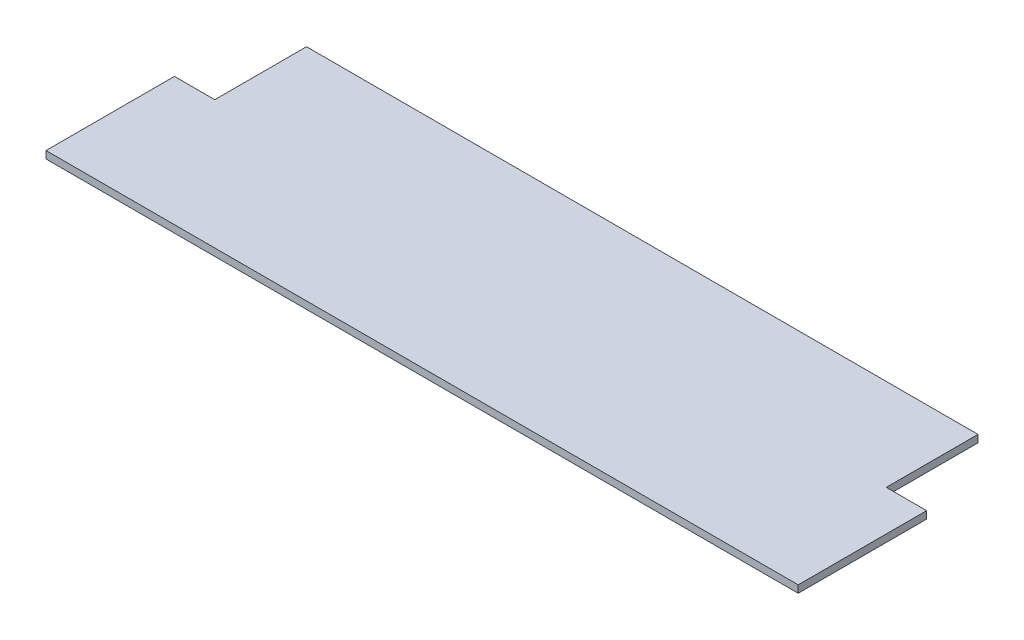
ISO-10303-21;
HEADER;
FILE_DESCRIPTION(('STEP AP214'),'2;1');
FILE_NAME('part.step','',(''),(''),'','','');
FILE_SCHEMA(('AUTOMOTIVE_DESIGN { 1 0 10303 214 1 1 1 1 }'));
ENDSEC;
DATA;
#1=APPLICATION_CONTEXT('core data for automotive mechanical design processes');
#2=APPLICATION_PROTOCOL_DEFINITION('international standard','automotive_design',2000,#1);
#3=PRODUCT_CONTEXT('',#1,'mechanical');
#4=PRODUCT('Part','Part','',(#3));
#5=PRODUCT_RELATED_PRODUCT_CATEGORY('part','',(#4));
#6=PRODUCT_DEFINITION_FORMATION('','',#4);
#7=PRODUCT_DEFINITION_CONTEXT('part definition',#1,'design');
#8=PRODUCT_DEFINITION('design','',#6,#7);
#9=PRODUCT_DEFINITION_SHAPE('','',#8);
#10=(LENGTH_UNIT() NAMED_UNIT(*) SI_UNIT(.MILLI.,.METRE.));
#11=(NAMED_UNIT(*) PLANE_ANGLE_UNIT() SI_UNIT($,.RADIAN.));
#12=(NAMED_UNIT(*) SI_UNIT($,.STERADIAN.) SOLID_ANGLE_UNIT());
#13=UNCERTAINTY_MEASURE_WITH_UNIT(LENGTH_MEASURE(1.E-05),#10,'distance_accuracy_value','');
#14=(GEOMETRIC_REPRESENTATION_CONTEXT(3) GLOBAL_UNCERTAINTY_ASSIGNED_CONTEXT((#13)) GLOBAL_UNIT_ASSIGNED_CONTEXT((#10,
#11,#12)) REPRESENTATION_CONTEXT('',''));
#15=CARTESIAN_POINT('',(0.,0.,0.));
#16=DIRECTION('',(0.,0.,1.));
#17=DIRECTION('',(1.,0.,0.));
#18=AXIS2_PLACEMENT_3D('',#15,#16,#17);
#19=CARTESIAN_POINT('',(205.,4.,-60.));
#20=DIRECTION('',(-1.,0.,0.));
#21=DIRECTION('',(0.,0.,1.));
#22=AXIS2_PLACEMENT_3D('',#19,#20,#21);
#23=PLANE('',#22);
#24=DIRECTION('',(0.,0.,-1.));
#25=VECTOR('',#24,1.);
#26=CARTESIAN_POINT('',(205.,0.,-60.));
#27=LINE('',#26,#25);
#28=CARTESIAN_POINT('',(205.,0.,60.));
#29=VERTEX_POINT('',#28);
#30=CARTESIAN_POINT('',(205.,0.,-10.0000000000042));
#31=VERTEX_POINT('',#30);
#32=EDGE_CURVE('E135',#29,#31,#27,.T.);
#33=ORIENTED_EDGE('',*,*,#32,.T.);
#34=DIRECTION('',(0.,-1.,0.));
#35=VECTOR('',#34,1.);
#36=CARTESIAN_POINT('',(205.,-0.00100000000000013,-10.0000000000042));
#37=LINE('',#36,#35);
#38=CARTESIAN_POINT('',(205.,4.,-10.0000000000042));
#39=VERTEX_POINT('',#38);
#40=EDGE_CURVE('E69',#39,#31,#37,.T.);
#41=ORIENTED_EDGE('',*,*,#40,.F.);
#42=DIRECTION('',(0.,0.,-1.));
#43=VECTOR('',#42,1.);
#44=CARTESIAN_POINT('',(205.,4.,-60.));
#45=LINE('',#44,#43);
#46=CARTESIAN_POINT('',(205.,4.,60.));
#47=VERTEX_POINT('',#46);
#48=EDGE_CURVE('E144',#47,#39,#45,.T.);
#49=ORIENTED_EDGE('',*,*,#48,.F.);
#50=DIRECTION('',(0.,-1.,0.));
#51=VECTOR('',#50,1.);
#52=CARTESIAN_POINT('',(205.,4.,60.));
#53=LINE('',#52,#51);
#54=EDGE_CURVE('E54',#47,#29,#53,.T.);
#55=ORIENTED_EDGE('',*,*,#54,.T.);
#56=EDGE_LOOP('',(#33,#41,#49,#55));
#57=FACE_BOUND('',#56,.T.);
#58=ADVANCED_FACE('F47',(#57),#23,.F.);
#59=CARTESIAN_POINT('',(-205.,4.,-60.));
#60=DIRECTION('',(0.,0.,1.));
#61=DIRECTION('',(1.,0.,0.));
#62=AXIS2_PLACEMENT_3D('',#59,#60,#61);
#63=PLANE('',#62);
#64=DIRECTION('',(-1.,0.,0.));
#65=VECTOR('',#64,1.);
#66=CARTESIAN_POINT('',(-205.,4.,-60.));
#67=LINE('',#66,#65);
#68=CARTESIAN_POINT('',(183.000000000007,4.,-60.));
#69=VERTEX_POINT('',#68);
#70=CARTESIAN_POINT('',(-183.000000000007,4.,-60.));
#71=VERTEX_POINT('',#70);
#72=EDGE_CURVE('E128',#69,#71,#67,.T.);
#73=ORIENTED_EDGE('',*,*,#72,.F.);
#74=DIRECTION('',(0.,1.,0.));
#75=VECTOR('',#74,1.);
#76=CARTESIAN_POINT('',(183.000000000007,-0.00100000000000013,-60.));
#77=LINE('',#76,#75);
#78=CARTESIAN_POINT('',(183.000000000007,0.,-60.));
#79=VERTEX_POINT('',#78);
#80=EDGE_CURVE('E115',#79,#69,#77,.T.);
#81=ORIENTED_EDGE('',*,*,#80,.F.);
#82=DIRECTION('',(-1.,0.,0.));
#83=VECTOR('',#82,1.);
#84=CARTESIAN_POINT('',(-205.,0.,-60.));
#85=LINE('',#84,#83);
#86=CARTESIAN_POINT('',(-183.000000000007,0.,-60.));
#87=VERTEX_POINT('',#86);
#88=EDGE_CURVE('E126',#79,#87,#85,.T.);
#89=ORIENTED_EDGE('',*,*,#88,.T.);
#90=DIRECTION('',(0.,-1.,0.));
#91=VECTOR('',#90,1.);
#92=CARTESIAN_POINT('',(-183.000000000007,-0.00100000000000013,-60.));
#93=LINE('',#92,#91);
#94=EDGE_CURVE('E61',#71,#87,#93,.T.);
#95=ORIENTED_EDGE('',*,*,#94,.F.);
#96=EDGE_LOOP('',(#73,#81,#89,#95));
#97=FACE_BOUND('',#96,.T.);
#98=ADVANCED_FACE('F125',(#97),#63,.F.);
#99=CARTESIAN_POINT('',(-205.,4.,-60.));
#100=DIRECTION('',(1.,0.,0.));
#101=DIRECTION('',(0.,0.,-1.));
#102=AXIS2_PLACEMENT_3D('',#99,#100,#101);
#103=PLANE('',#102);
#104=DIRECTION('',(0.,0.,1.));
#105=VECTOR('',#104,1.);
#106=CARTESIAN_POINT('',(-205.,4.,-60.));
#107=LINE('',#106,#105);
#108=CARTESIAN_POINT('',(-205.,4.,-10.0000000000042));
#109=VERTEX_POINT('',#108);
#110=CARTESIAN_POINT('',(-205.,4.,60.));
#111=VERTEX_POINT('',#110);
#112=EDGE_CURVE('E151',#109,#111,#107,.T.);
#113=ORIENTED_EDGE('',*,*,#112,.F.);
#114=DIRECTION('',(0.,1.,0.));
#115=VECTOR('',#114,1.);
#116=CARTESIAN_POINT('',(-205.,-0.00100000000000013,-10.0000000000042));
#117=LINE('',#116,#115);
#118=CARTESIAN_POINT('',(-205.,0.,-10.0000000000042));
#119=VERTEX_POINT('',#118);
#120=EDGE_CURVE('E129',#119,#109,#117,.T.);
#121=ORIENTED_EDGE('',*,*,#120,.F.);
#122=DIRECTION('',(0.,0.,1.));
#123=VECTOR('',#122,1.);
#124=CARTESIAN_POINT('',(-205.,0.,-60.));
#125=LINE('',#124,#123);
#126=CARTESIAN_POINT('',(-205.,0.,60.));
#127=VERTEX_POINT('',#126);
#128=EDGE_CURVE('E134',#119,#127,#125,.T.);
#129=ORIENTED_EDGE('',*,*,#128,.T.);
#130=DIRECTION('',(0.,-1.,0.));
#131=VECTOR('',#130,1.);
#132=CARTESIAN_POINT('',(-205.,4.,60.));
#133=LINE('',#132,#131);
#134=EDGE_CURVE('E11',#111,#127,#133,.T.);
#135=ORIENTED_EDGE('',*,*,#134,.F.);
#136=EDGE_LOOP('',(#113,#121,#129,#135));
#137=FACE_BOUND('',#136,.T.);
#138=ADVANCED_FACE('F186',(#137),#103,.F.);
#139=CARTESIAN_POINT('',(-205.,4.,60.));
#140=DIRECTION('',(0.,0.,-1.));
#141=DIRECTION('',(-1.,0.,0.));
#142=AXIS2_PLACEMENT_3D('',#139,#140,#141);
#143=PLANE('',#142);
#144=DIRECTION('',(1.,0.,0.));
#145=VECTOR('',#144,1.);
#146=CARTESIAN_POINT('',(-205.,0.,60.));
#147=LINE('',#146,#145);
#148=EDGE_CURVE('E137',#127,#29,#147,.T.);
#149=ORIENTED_EDGE('',*,*,#148,.T.);
#150=ORIENTED_EDGE('',*,*,#54,.F.);
#151=DIRECTION('',(1.,0.,0.));
#152=VECTOR('',#151,1.);
#153=CARTESIAN_POINT('',(-205.,4.,60.));
#154=LINE('',#153,#152);
#155=EDGE_CURVE('E146',#111,#47,#154,.T.);
#156=ORIENTED_EDGE('',*,*,#155,.F.);
#157=ORIENTED_EDGE('',*,*,#134,.T.);
#158=EDGE_LOOP('',(#149,#150,#156,#157));
#159=FACE_BOUND('',#158,.T.);
#160=ADVANCED_FACE('F182',(#159),#143,.F.);
#161=CARTESIAN_POINT('',(0.,4.,0.));
#162=DIRECTION('',(0.,1.,0.));
#163=DIRECTION('',(0.,0.,1.));
#164=AXIS2_PLACEMENT_3D('',#161,#162,#163);
#165=PLANE('',#164);
#166=DIRECTION('',(0.,0.,1.));
#167=VECTOR('',#166,1.);
#168=CARTESIAN_POINT('',(183.000000000007,4.,-10.0000000000042));
#169=LINE('',#168,#167);
#170=CARTESIAN_POINT('',(183.000000000007,4.,-10.0000000000042));
#171=VERTEX_POINT('',#170);
#172=EDGE_CURVE('E120',#69,#171,#169,.T.);
#173=ORIENTED_EDGE('',*,*,#172,.F.);
#174=ORIENTED_EDGE('',*,*,#72,.T.);
#175=DIRECTION('',(0.,0.,-1.));
#176=VECTOR('',#175,1.);
#177=CARTESIAN_POINT('',(-183.000000000007,4.,-10.0000000000042));
#178=LINE('',#177,#176);
#179=CARTESIAN_POINT('',(-183.000000000007,4.,-10.0000000000042));
#180=VERTEX_POINT('',#179);
#181=EDGE_CURVE('E166',#180,#71,#178,.T.);
#182=ORIENTED_EDGE('',*,*,#181,.F.);
#183=DIRECTION('',(1.,0.,0.));
#184=VECTOR('',#183,1.);
#185=CARTESIAN_POINT('',(-183.000000000007,4.,-10.0000000000042));
#186=LINE('',#185,#184);
#187=EDGE_CURVE('E163',#109,#180,#186,.T.);
#188=ORIENTED_EDGE('',*,*,#187,.F.);
#189=ORIENTED_EDGE('',*,*,#112,.T.);
#190=ORIENTED_EDGE('',*,*,#155,.T.);
#191=ORIENTED_EDGE('',*,*,#48,.T.);
#192=DIRECTION('',(1.,0.,0.));
#193=VECTOR('',#192,1.);
#194=CARTESIAN_POINT('',(183.000000000007,4.,-10.0000000000042));
#195=LINE('',#194,#193);
#196=EDGE_CURVE('E173',#171,#39,#195,.T.);
#197=ORIENTED_EDGE('',*,*,#196,.F.);
#198=EDGE_LOOP('',(#173,#174,#182,#188,#189,#190,#191,#197));
#199=FACE_BOUND('',#198,.T.);
#200=ADVANCED_FACE('F177',(#199),#165,.T.);
#201=CARTESIAN_POINT('',(0.,0.,0.));
#202=DIRECTION('',(0.,1.,0.));
#203=DIRECTION('',(0.,0.,1.));
#204=AXIS2_PLACEMENT_3D('',#201,#202,#203);
#205=PLANE('',#204);
#206=ORIENTED_EDGE('',*,*,#88,.F.);
#207=DIRECTION('',(0.,0.,-1.));
#208=VECTOR('',#207,1.);
#209=CARTESIAN_POINT('',(183.000000000007,0.,-10.0000000000042));
#210=LINE('',#209,#208);
#211=CARTESIAN_POINT('',(183.000000000007,0.,-10.0000000000042));
#212=VERTEX_POINT('',#211);
#213=EDGE_CURVE('E111',#212,#79,#210,.T.);
#214=ORIENTED_EDGE('',*,*,#213,.F.);
#215=DIRECTION('',(-1.,0.,0.));
#216=VECTOR('',#215,1.);
#217=CARTESIAN_POINT('',(183.000000000007,0.,-10.0000000000042));
#218=LINE('',#217,#216);
#219=EDGE_CURVE('E140',#31,#212,#218,.T.);
#220=ORIENTED_EDGE('',*,*,#219,.F.);
#221=ORIENTED_EDGE('',*,*,#32,.F.);
#222=ORIENTED_EDGE('',*,*,#148,.F.);
#223=ORIENTED_EDGE('',*,*,#128,.F.);
#224=DIRECTION('',(-1.,0.,0.));
#225=VECTOR('',#224,1.);
#226=CARTESIAN_POINT('',(-183.000000000007,0.,-10.0000000000042));
#227=LINE('',#226,#225);
#228=CARTESIAN_POINT('',(-183.000000000007,0.,-10.0000000000042));
#229=VERTEX_POINT('',#228);
#230=EDGE_CURVE('E161',#229,#119,#227,.T.);
#231=ORIENTED_EDGE('',*,*,#230,.F.);
#232=DIRECTION('',(0.,0.,1.));
#233=VECTOR('',#232,1.);
#234=CARTESIAN_POINT('',(-183.000000000007,0.,-10.0000000000042));
#235=LINE('',#234,#233);
#236=EDGE_CURVE('E133',#87,#229,#235,.T.);
#237=ORIENTED_EDGE('',*,*,#236,.F.);
#238=EDGE_LOOP('',(#206,#214,#220,#221,#222,#223,#231,#237));
#239=FACE_BOUND('',#238,.T.);
#240=ADVANCED_FACE('F131',(#239),#205,.F.);
#241=CARTESIAN_POINT('',(-183.000000000007,-0.00100000000000013,-10.0000000000042));
#242=DIRECTION('',(0.,0.,1.));
#243=DIRECTION('',(1.,0.,0.));
#244=AXIS2_PLACEMENT_3D('',#241,#242,#243);
#245=PLANE('',#244);
#246=ORIENTED_EDGE('',*,*,#120,.T.);
#247=ORIENTED_EDGE('',*,*,#187,.T.);
#248=DIRECTION('',(0.,1.,0.));
#249=VECTOR('',#248,1.);
#250=CARTESIAN_POINT('',(-183.000000000007,-0.00100000000000013,-10.0000000000042));
#251=LINE('',#250,#249);
#252=EDGE_CURVE('E168',#229,#180,#251,.T.);
#253=ORIENTED_EDGE('',*,*,#252,.F.);
#254=ORIENTED_EDGE('',*,*,#230,.T.);
#255=EDGE_LOOP('',(#246,#247,#253,#254));
#256=FACE_BOUND('',#255,.T.);
#257=ADVANCED_FACE('F190',(#256),#245,.F.);
#258=CARTESIAN_POINT('',(-183.000000000007,-0.00100000000000013,-10.0000000000042));
#259=DIRECTION('',(1.,0.,0.));
#260=DIRECTION('',(0.,0.,-1.));
#261=AXIS2_PLACEMENT_3D('',#258,#259,#260);
#262=PLANE('',#261);
#263=ORIENTED_EDGE('',*,*,#94,.T.);
#264=ORIENTED_EDGE('',*,*,#236,.T.);
#265=ORIENTED_EDGE('',*,*,#252,.T.);
#266=ORIENTED_EDGE('',*,*,#181,.T.);
#267=EDGE_LOOP('',(#263,#264,#265,#266));
#268=FACE_BOUND('',#267,.T.);
#269=ADVANCED_FACE('F193',(#268),#262,.F.);
#270=CARTESIAN_POINT('',(183.000000000007,-0.00100000000000013,-10.0000000000042));
#271=DIRECTION('',(-1.,0.,0.));
#272=DIRECTION('',(0.,0.,1.));
#273=AXIS2_PLACEMENT_3D('',#270,#271,#272);
#274=PLANE('',#273);
#275=ORIENTED_EDGE('',*,*,#80,.T.);
#276=ORIENTED_EDGE('',*,*,#172,.T.);
#277=DIRECTION('',(0.,1.,0.));
#278=VECTOR('',#277,1.);
#279=CARTESIAN_POINT('',(183.000000000007,-0.00100000000000013,-10.0000000000042));
#280=LINE('',#279,#278);
#281=EDGE_CURVE('E117',#212,#171,#280,.T.);
#282=ORIENTED_EDGE('',*,*,#281,.F.);
#283=ORIENTED_EDGE('',*,*,#213,.T.);
#284=EDGE_LOOP('',(#275,#276,#282,#283));
#285=FACE_BOUND('',#284,.T.);
#286=ADVANCED_FACE('F113',(#285),#274,.F.);
#287=CARTESIAN_POINT('',(183.000000000007,-0.00100000000000013,-10.0000000000042));
#288=DIRECTION('',(0.,0.,1.));
#289=DIRECTION('',(1.,0.,0.));
#290=AXIS2_PLACEMENT_3D('',#287,#288,#289);
#291=PLANE('',#290);
#292=ORIENTED_EDGE('',*,*,#40,.T.);
#293=ORIENTED_EDGE('',*,*,#219,.T.);
#294=ORIENTED_EDGE('',*,*,#281,.T.);
#295=ORIENTED_EDGE('',*,*,#196,.T.);
#296=EDGE_LOOP('',(#292,#293,#294,#295));
#297=FACE_BOUND('',#296,.T.);
#298=ADVANCED_FACE('F178',(#297),#291,.F.);
#299=CLOSED_SHELL('',(#58,#98,#138,#160,#200,#240,#257,#269,#286,#298));
#300=MANIFOLD_SOLID_BREP('B2',#299);
#301=ADVANCED_BREP_SHAPE_REPRESENTATION('',(#18,#300),#14);
#302=SHAPE_DEFINITION_REPRESENTATION(#9,#301);
ENDSEC;
END-ISO-10303-21;
